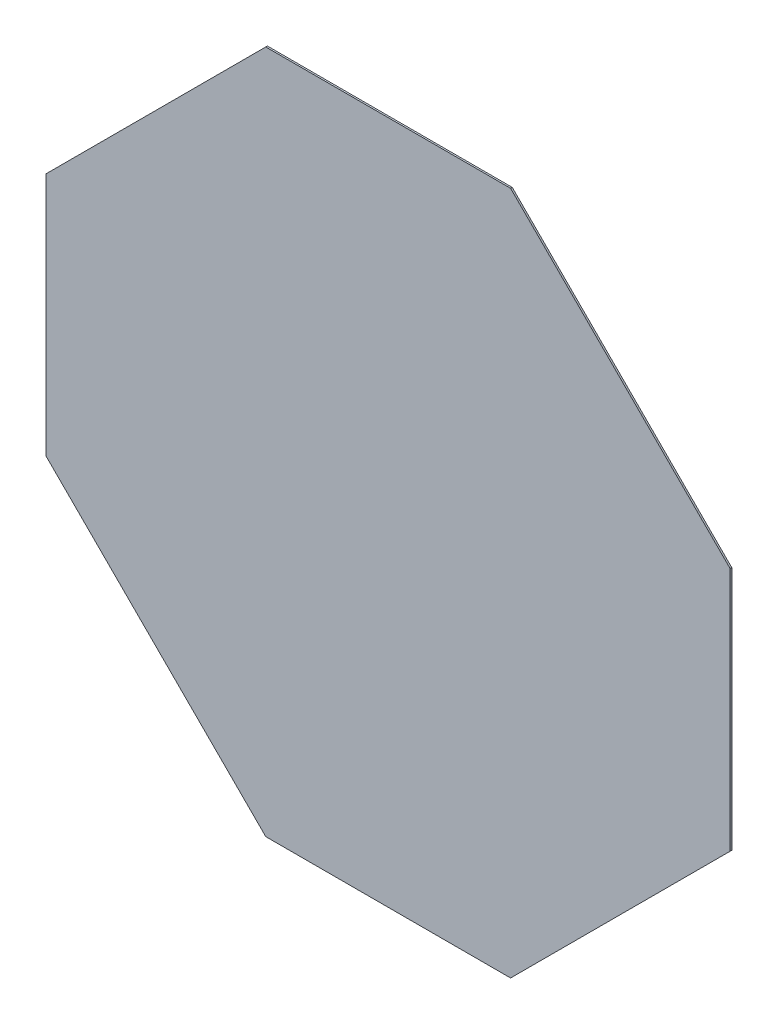
ISO-10303-21;
HEADER;
FILE_DESCRIPTION(('STEP AP214'),'2;1');
FILE_NAME('part.step','',(''),(''),'','','');
FILE_SCHEMA(('AUTOMOTIVE_DESIGN { 1 0 10303 214 1 1 1 1 }'));
ENDSEC;
DATA;
#1=APPLICATION_CONTEXT('core data for automotive mechanical design processes');
#2=APPLICATION_PROTOCOL_DEFINITION('international standard','automotive_design',2000,#1);
#3=PRODUCT_CONTEXT('',#1,'mechanical');
#4=PRODUCT('Part','Part','',(#3));
#5=PRODUCT_RELATED_PRODUCT_CATEGORY('part','',(#4));
#6=PRODUCT_DEFINITION_FORMATION('','',#4);
#7=PRODUCT_DEFINITION_CONTEXT('part definition',#1,'design');
#8=PRODUCT_DEFINITION('design','',#6,#7);
#9=PRODUCT_DEFINITION_SHAPE('','',#8);
#10=(LENGTH_UNIT() NAMED_UNIT(*) SI_UNIT(.MILLI.,.METRE.));
#11=(NAMED_UNIT(*) PLANE_ANGLE_UNIT() SI_UNIT($,.RADIAN.));
#12=(NAMED_UNIT(*) SI_UNIT($,.STERADIAN.) SOLID_ANGLE_UNIT());
#13=UNCERTAINTY_MEASURE_WITH_UNIT(LENGTH_MEASURE(1.E-05),#10,'distance_accuracy_value','');
#14=(GEOMETRIC_REPRESENTATION_CONTEXT(3) GLOBAL_UNCERTAINTY_ASSIGNED_CONTEXT((#13)) GLOBAL_UNIT_ASSIGNED_CONTEXT((#10,
#11,#12)) REPRESENTATION_CONTEXT('',''));
#15=CARTESIAN_POINT('',(0.,0.,0.));
#16=DIRECTION('',(0.,0.,1.));
#17=DIRECTION('',(1.,0.,0.));
#18=AXIS2_PLACEMENT_3D('',#15,#16,#17);
#19=CARTESIAN_POINT('',(9.49999999999999,249.999097193723,1.2));
#20=DIRECTION('',(0.,-1.,0.));
#21=DIRECTION('',(1.,0.,0.));
#22=AXIS2_PLACEMENT_3D('',#19,#20,#21);
#23=PLANE('',#22);
#24=DIRECTION('',(-1.,0.,0.));
#25=VECTOR('',#24,1.);
#26=CARTESIAN_POINT('',(9.49999999999999,249.999097193723,0.));
#27=LINE('',#26,#25);
#28=CARTESIAN_POINT('',(9.49999999999999,249.999097193723,0.));
#29=VERTEX_POINT('',#28);
#30=CARTESIAN_POINT('',(-169.5,249.999097193723,0.));
#31=VERTEX_POINT('',#30);
#32=EDGE_CURVE('E133',#29,#31,#27,.T.);
#33=ORIENTED_EDGE('',*,*,#32,.T.);
#34=DIRECTION('',(0.,0.,-1.));
#35=VECTOR('',#34,1.);
#36=CARTESIAN_POINT('',(-169.5,249.999097193723,1.2));
#37=LINE('',#36,#35);
#38=CARTESIAN_POINT('',(-169.5,249.999097193723,1.2));
#39=VERTEX_POINT('',#38);
#40=EDGE_CURVE('E11',#39,#31,#37,.T.);
#41=ORIENTED_EDGE('',*,*,#40,.F.);
#42=DIRECTION('',(-1.,0.,0.));
#43=VECTOR('',#42,1.);
#44=CARTESIAN_POINT('',(9.49999999999999,249.999097193723,1.2));
#45=LINE('',#44,#43);
#46=CARTESIAN_POINT('',(9.49999999999999,249.999097193723,1.2));
#47=VERTEX_POINT('',#46);
#48=EDGE_CURVE('E147',#47,#39,#45,.T.);
#49=ORIENTED_EDGE('',*,*,#48,.F.);
#50=DIRECTION('',(0.,0.,-1.));
#51=VECTOR('',#50,1.);
#52=CARTESIAN_POINT('',(9.49999999999999,249.999097193723,1.2));
#53=LINE('',#52,#51);
#54=EDGE_CURVE('E129',#47,#29,#53,.T.);
#55=ORIENTED_EDGE('',*,*,#54,.T.);
#56=EDGE_LOOP('',(#33,#41,#49,#55));
#57=FACE_BOUND('',#56,.T.);
#58=ADVANCED_FACE('F37',(#57),#23,.F.);
#59=CARTESIAN_POINT('',(-329.999097193723,89.5000000000001,1.2));
#60=DIRECTION('',(0.707106781186548,-0.707106781186547,0.));
#61=DIRECTION('',(0.707106781186547,0.707106781186548,0.));
#62=AXIS2_PLACEMENT_3D('',#59,#60,#61);
#63=PLANE('',#62);
#64=DIRECTION('',(-0.707106781186547,-0.707106781186548,0.));
#65=VECTOR('',#64,1.);
#66=CARTESIAN_POINT('',(-329.999097193723,89.5000000000001,0.));
#67=LINE('',#66,#65);
#68=CARTESIAN_POINT('',(-329.999097193723,89.5000000000001,0.));
#69=VERTEX_POINT('',#68);
#70=EDGE_CURVE('E136',#31,#69,#67,.T.);
#71=ORIENTED_EDGE('',*,*,#70,.T.);
#72=DIRECTION('',(0.,0.,-1.));
#73=VECTOR('',#72,1.);
#74=CARTESIAN_POINT('',(-329.999097193723,89.5000000000001,1.2));
#75=LINE('',#74,#73);
#76=CARTESIAN_POINT('',(-329.999097193723,89.5000000000001,1.2));
#77=VERTEX_POINT('',#76);
#78=EDGE_CURVE('E45',#77,#69,#75,.T.);
#79=ORIENTED_EDGE('',*,*,#78,.F.);
#80=DIRECTION('',(-0.707106781186547,-0.707106781186548,0.));
#81=VECTOR('',#80,1.);
#82=CARTESIAN_POINT('',(-329.999097193723,89.5000000000001,1.2));
#83=LINE('',#82,#81);
#84=EDGE_CURVE('E96',#39,#77,#83,.T.);
#85=ORIENTED_EDGE('',*,*,#84,.F.);
#86=ORIENTED_EDGE('',*,*,#40,.T.);
#87=EDGE_LOOP('',(#71,#79,#85,#86));
#88=FACE_BOUND('',#87,.T.);
#89=ADVANCED_FACE('F182',(#88),#63,.F.);
#90=CARTESIAN_POINT('',(-329.999097193723,89.5000000000001,1.2));
#91=DIRECTION('',(1.,0.,0.));
#92=DIRECTION('',(0.,0.,-1.));
#93=AXIS2_PLACEMENT_3D('',#90,#91,#92);
#94=PLANE('',#93);
#95=DIRECTION('',(0.,-1.,0.));
#96=VECTOR('',#95,1.);
#97=CARTESIAN_POINT('',(-329.999097193723,89.5000000000001,0.));
#98=LINE('',#97,#96);
#99=CARTESIAN_POINT('',(-329.999097193723,-89.4999999999999,0.));
#100=VERTEX_POINT('',#99);
#101=EDGE_CURVE('E138',#69,#100,#98,.T.);
#102=ORIENTED_EDGE('',*,*,#101,.T.);
#103=DIRECTION('',(0.,0.,-1.));
#104=VECTOR('',#103,1.);
#105=CARTESIAN_POINT('',(-329.999097193723,-89.4999999999999,1.2));
#106=LINE('',#105,#104);
#107=CARTESIAN_POINT('',(-329.999097193723,-89.4999999999999,1.2));
#108=VERTEX_POINT('',#107);
#109=EDGE_CURVE('E154',#108,#100,#106,.T.);
#110=ORIENTED_EDGE('',*,*,#109,.F.);
#111=DIRECTION('',(0.,-1.,0.));
#112=VECTOR('',#111,1.);
#113=CARTESIAN_POINT('',(-329.999097193723,89.5000000000001,1.2));
#114=LINE('',#113,#112);
#115=EDGE_CURVE('E162',#77,#108,#114,.T.);
#116=ORIENTED_EDGE('',*,*,#115,.F.);
#117=ORIENTED_EDGE('',*,*,#78,.T.);
#118=EDGE_LOOP('',(#102,#110,#116,#117));
#119=FACE_BOUND('',#118,.T.);
#120=ADVANCED_FACE('F160',(#119),#94,.F.);
#121=CARTESIAN_POINT('',(-169.5,-249.999097193722,1.2));
#122=DIRECTION('',(0.707106781186548,0.707106781186547,0.));
#123=DIRECTION('',(-0.707106781186547,0.707106781186548,0.));
#124=AXIS2_PLACEMENT_3D('',#121,#122,#123);
#125=PLANE('',#124);
#126=DIRECTION('',(0.707106781186547,-0.707106781186548,0.));
#127=VECTOR('',#126,1.);
#128=CARTESIAN_POINT('',(-169.5,-249.999097193722,0.));
#129=LINE('',#128,#127);
#130=CARTESIAN_POINT('',(-169.5,-249.999097193722,0.));
#131=VERTEX_POINT('',#130);
#132=EDGE_CURVE('E140',#100,#131,#129,.T.);
#133=ORIENTED_EDGE('',*,*,#132,.T.);
#134=DIRECTION('',(0.,0.,-1.));
#135=VECTOR('',#134,1.);
#136=CARTESIAN_POINT('',(-169.5,-249.999097193722,1.2));
#137=LINE('',#136,#135);
#138=CARTESIAN_POINT('',(-169.5,-249.999097193722,1.2));
#139=VERTEX_POINT('',#138);
#140=EDGE_CURVE('E151',#139,#131,#137,.T.);
#141=ORIENTED_EDGE('',*,*,#140,.F.);
#142=DIRECTION('',(0.707106781186547,-0.707106781186548,0.));
#143=VECTOR('',#142,1.);
#144=CARTESIAN_POINT('',(-169.5,-249.999097193722,1.2));
#145=LINE('',#144,#143);
#146=EDGE_CURVE('E174',#108,#139,#145,.T.);
#147=ORIENTED_EDGE('',*,*,#146,.F.);
#148=ORIENTED_EDGE('',*,*,#109,.T.);
#149=EDGE_LOOP('',(#133,#141,#147,#148));
#150=FACE_BOUND('',#149,.T.);
#151=ADVANCED_FACE('F170',(#150),#125,.F.);
#152=CARTESIAN_POINT('',(-169.5,-249.999097193722,1.2));
#153=DIRECTION('',(0.,1.,0.));
#154=DIRECTION('',(0.,0.,1.));
#155=AXIS2_PLACEMENT_3D('',#152,#153,#154);
#156=PLANE('',#155);
#157=DIRECTION('',(1.,0.,0.));
#158=VECTOR('',#157,1.);
#159=CARTESIAN_POINT('',(-169.5,-249.999097193722,0.));
#160=LINE('',#159,#158);
#161=CARTESIAN_POINT('',(9.50000000000002,-249.999097193722,0.));
#162=VERTEX_POINT('',#161);
#163=EDGE_CURVE('E142',#131,#162,#160,.T.);
#164=ORIENTED_EDGE('',*,*,#163,.T.);
#165=DIRECTION('',(0.,0.,-1.));
#166=VECTOR('',#165,1.);
#167=CARTESIAN_POINT('',(9.50000000000002,-249.999097193722,1.2));
#168=LINE('',#167,#166);
#169=CARTESIAN_POINT('',(9.50000000000002,-249.999097193722,1.2));
#170=VERTEX_POINT('',#169);
#171=EDGE_CURVE('E124',#170,#162,#168,.T.);
#172=ORIENTED_EDGE('',*,*,#171,.F.);
#173=DIRECTION('',(1.,0.,0.));
#174=VECTOR('',#173,1.);
#175=CARTESIAN_POINT('',(-169.5,-249.999097193722,1.2));
#176=LINE('',#175,#174);
#177=EDGE_CURVE('E115',#139,#170,#176,.T.);
#178=ORIENTED_EDGE('',*,*,#177,.F.);
#179=ORIENTED_EDGE('',*,*,#140,.T.);
#180=EDGE_LOOP('',(#164,#172,#178,#179));
#181=FACE_BOUND('',#180,.T.);
#182=ADVANCED_FACE('F173',(#181),#156,.F.);
#183=CARTESIAN_POINT('',(169.999097193723,-89.4999999999999,1.2));
#184=DIRECTION('',(-0.707106781186548,0.707106781186548,0.));
#185=DIRECTION('',(-0.707106781186548,-0.707106781186547,0.));
#186=AXIS2_PLACEMENT_3D('',#183,#184,#185);
#187=PLANE('',#186);
#188=DIRECTION('',(0.707106781186547,0.707106781186547,0.));
#189=VECTOR('',#188,1.);
#190=CARTESIAN_POINT('',(169.999097193723,-89.4999999999999,0.));
#191=LINE('',#190,#189);
#192=CARTESIAN_POINT('',(169.999097193723,-89.4999999999999,0.));
#193=VERTEX_POINT('',#192);
#194=EDGE_CURVE('E123',#162,#193,#191,.T.);
#195=ORIENTED_EDGE('',*,*,#194,.T.);
#196=DIRECTION('',(0.,0.,-1.));
#197=VECTOR('',#196,1.);
#198=CARTESIAN_POINT('',(169.999097193723,-89.4999999999999,1.2));
#199=LINE('',#198,#197);
#200=CARTESIAN_POINT('',(169.999097193723,-89.4999999999999,1.2));
#201=VERTEX_POINT('',#200);
#202=EDGE_CURVE('E120',#201,#193,#199,.T.);
#203=ORIENTED_EDGE('',*,*,#202,.F.);
#204=DIRECTION('',(0.707106781186547,0.707106781186547,0.));
#205=VECTOR('',#204,1.);
#206=CARTESIAN_POINT('',(169.999097193723,-89.4999999999999,1.2));
#207=LINE('',#206,#205);
#208=EDGE_CURVE('E109',#170,#201,#207,.T.);
#209=ORIENTED_EDGE('',*,*,#208,.F.);
#210=ORIENTED_EDGE('',*,*,#171,.T.);
#211=EDGE_LOOP('',(#195,#203,#209,#210));
#212=FACE_BOUND('',#211,.T.);
#213=ADVANCED_FACE('F121',(#212),#187,.F.);
#214=CARTESIAN_POINT('',(169.999097193723,-89.4999999999999,1.2));
#215=DIRECTION('',(-1.,0.,0.));
#216=DIRECTION('',(0.,0.,1.));
#217=AXIS2_PLACEMENT_3D('',#214,#215,#216);
#218=PLANE('',#217);
#219=DIRECTION('',(0.,1.,0.));
#220=VECTOR('',#219,1.);
#221=CARTESIAN_POINT('',(169.999097193723,-89.4999999999999,0.));
#222=LINE('',#221,#220);
#223=CARTESIAN_POINT('',(169.999097193723,89.5000000000001,0.));
#224=VERTEX_POINT('',#223);
#225=EDGE_CURVE('E82',#193,#224,#222,.T.);
#226=ORIENTED_EDGE('',*,*,#225,.T.);
#227=DIRECTION('',(0.,0.,-1.));
#228=VECTOR('',#227,1.);
#229=CARTESIAN_POINT('',(169.999097193723,89.5000000000001,1.2));
#230=LINE('',#229,#228);
#231=CARTESIAN_POINT('',(169.999097193723,89.5000000000001,1.2));
#232=VERTEX_POINT('',#231);
#233=EDGE_CURVE('E125',#232,#224,#230,.T.);
#234=ORIENTED_EDGE('',*,*,#233,.F.);
#235=DIRECTION('',(0.,1.,0.));
#236=VECTOR('',#235,1.);
#237=CARTESIAN_POINT('',(169.999097193723,-89.4999999999999,1.2));
#238=LINE('',#237,#236);
#239=EDGE_CURVE('E113',#201,#232,#238,.T.);
#240=ORIENTED_EDGE('',*,*,#239,.F.);
#241=ORIENTED_EDGE('',*,*,#202,.T.);
#242=EDGE_LOOP('',(#226,#234,#240,#241));
#243=FACE_BOUND('',#242,.T.);
#244=ADVANCED_FACE('F127',(#243),#218,.F.);
#245=CARTESIAN_POINT('',(9.49999999999999,249.999097193723,1.2));
#246=DIRECTION('',(-0.707106781186548,-0.707106781186548,0.));
#247=DIRECTION('',(0.707106781186548,-0.707106781186547,0.));
#248=AXIS2_PLACEMENT_3D('',#245,#246,#247);
#249=PLANE('',#248);
#250=DIRECTION('',(-0.707106781186547,0.707106781186547,0.));
#251=VECTOR('',#250,1.);
#252=CARTESIAN_POINT('',(9.49999999999999,249.999097193723,0.));
#253=LINE('',#252,#251);
#254=EDGE_CURVE('E88',#224,#29,#253,.T.);
#255=ORIENTED_EDGE('',*,*,#254,.T.);
#256=ORIENTED_EDGE('',*,*,#54,.F.);
#257=DIRECTION('',(-0.707106781186547,0.707106781186547,0.));
#258=VECTOR('',#257,1.);
#259=CARTESIAN_POINT('',(9.49999999999999,249.999097193723,1.2));
#260=LINE('',#259,#258);
#261=EDGE_CURVE('E53',#232,#47,#260,.T.);
#262=ORIENTED_EDGE('',*,*,#261,.F.);
#263=ORIENTED_EDGE('',*,*,#233,.T.);
#264=EDGE_LOOP('',(#255,#256,#262,#263));
#265=FACE_BOUND('',#264,.T.);
#266=ADVANCED_FACE('F198',(#265),#249,.F.);
#267=CARTESIAN_POINT('',(0.,0.,1.2));
#268=DIRECTION('',(0.,0.,1.));
#269=DIRECTION('',(1.,0.,0.));
#270=AXIS2_PLACEMENT_3D('',#267,#268,#269);
#271=PLANE('',#270);
#272=ORIENTED_EDGE('',*,*,#48,.T.);
#273=ORIENTED_EDGE('',*,*,#84,.T.);
#274=ORIENTED_EDGE('',*,*,#115,.T.);
#275=ORIENTED_EDGE('',*,*,#146,.T.);
#276=ORIENTED_EDGE('',*,*,#177,.T.);
#277=ORIENTED_EDGE('',*,*,#208,.T.);
#278=ORIENTED_EDGE('',*,*,#239,.T.);
#279=ORIENTED_EDGE('',*,*,#261,.T.);
#280=EDGE_LOOP('',(#272,#273,#274,#275,#276,#277,#278,#279));
#281=FACE_BOUND('',#280,.T.);
#282=ADVANCED_FACE('F111',(#281),#271,.T.);
#283=CARTESIAN_POINT('',(0.,0.,0.));
#284=DIRECTION('',(0.,0.,1.));
#285=DIRECTION('',(1.,0.,0.));
#286=AXIS2_PLACEMENT_3D('',#283,#284,#285);
#287=PLANE('',#286);
#288=ORIENTED_EDGE('',*,*,#32,.F.);
#289=ORIENTED_EDGE('',*,*,#254,.F.);
#290=ORIENTED_EDGE('',*,*,#225,.F.);
#291=ORIENTED_EDGE('',*,*,#194,.F.);
#292=ORIENTED_EDGE('',*,*,#163,.F.);
#293=ORIENTED_EDGE('',*,*,#132,.F.);
#294=ORIENTED_EDGE('',*,*,#101,.F.);
#295=ORIENTED_EDGE('',*,*,#70,.F.);
#296=EDGE_LOOP('',(#288,#289,#290,#291,#292,#293,#294,#295));
#297=FACE_BOUND('',#296,.T.);
#298=ADVANCED_FACE('F166',(#297),#287,.F.);
#299=CLOSED_SHELL('',(#58,#89,#120,#151,#182,#213,#244,#266,#282,#298));
#300=MANIFOLD_SOLID_BREP('B2',#299);
#301=ADVANCED_BREP_SHAPE_REPRESENTATION('',(#18,#300),#14);
#302=SHAPE_DEFINITION_REPRESENTATION(#9,#301);
ENDSEC;
END-ISO-10303-21;
